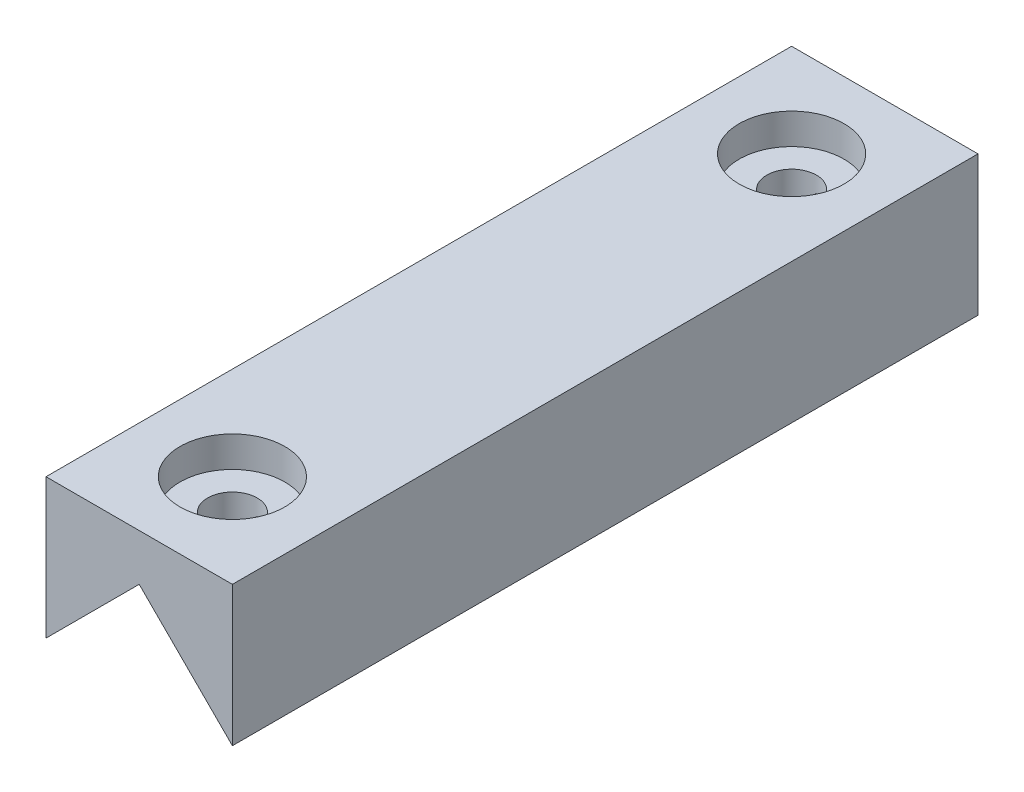
ISO-10303-21;
HEADER;
FILE_DESCRIPTION(('STEP AP214'),'2;1');
FILE_NAME('part.step','',(''),(''),'','','');
FILE_SCHEMA(('AUTOMOTIVE_DESIGN { 1 0 10303 214 1 1 1 1 }'));
ENDSEC;
DATA;
#1=APPLICATION_CONTEXT('core data for automotive mechanical design processes');
#2=APPLICATION_PROTOCOL_DEFINITION('international standard','automotive_design',2000,#1);
#3=PRODUCT_CONTEXT('',#1,'mechanical');
#4=PRODUCT('Part','Part','',(#3));
#5=PRODUCT_RELATED_PRODUCT_CATEGORY('part','',(#4));
#6=PRODUCT_DEFINITION_FORMATION('','',#4);
#7=PRODUCT_DEFINITION_CONTEXT('part definition',#1,'design');
#8=PRODUCT_DEFINITION('design','',#6,#7);
#9=PRODUCT_DEFINITION_SHAPE('','',#8);
#10=(LENGTH_UNIT() NAMED_UNIT(*) SI_UNIT(.MILLI.,.METRE.));
#11=(NAMED_UNIT(*) PLANE_ANGLE_UNIT() SI_UNIT($,.RADIAN.));
#12=(NAMED_UNIT(*) SI_UNIT($,.STERADIAN.) SOLID_ANGLE_UNIT());
#13=UNCERTAINTY_MEASURE_WITH_UNIT(LENGTH_MEASURE(1.E-05),#10,'distance_accuracy_value','');
#14=(GEOMETRIC_REPRESENTATION_CONTEXT(3) GLOBAL_UNCERTAINTY_ASSIGNED_CONTEXT((#13)) GLOBAL_UNIT_ASSIGNED_CONTEXT((#10,
#11,#12)) REPRESENTATION_CONTEXT('',''));
#15=CARTESIAN_POINT('',(0.,0.,0.));
#16=DIRECTION('',(0.,0.,1.));
#17=DIRECTION('',(1.,0.,0.));
#18=AXIS2_PLACEMENT_3D('',#15,#16,#17);
#19=CARTESIAN_POINT('',(0.,0.,101.6));
#20=DIRECTION('',(1.,0.,0.));
#21=DIRECTION('',(0.,1.,0.));
#22=AXIS2_PLACEMENT_3D('',#19,#20,#21);
#23=PLANE('',#22);
#24=DIRECTION('',(0.,-1.,0.));
#25=VECTOR('',#24,1.);
#26=CARTESIAN_POINT('',(0.,0.,0.));
#27=LINE('',#26,#25);
#28=CARTESIAN_POINT('',(0.,0.,0.));
#29=VERTEX_POINT('',#28);
#30=CARTESIAN_POINT('',(0.,-19.05,0.));
#31=VERTEX_POINT('',#30);
#32=EDGE_CURVE('E153',#29,#31,#27,.T.);
#33=ORIENTED_EDGE('',*,*,#32,.T.);
#34=DIRECTION('',(0.,0.,-1.));
#35=VECTOR('',#34,1.);
#36=CARTESIAN_POINT('',(0.,-19.05,101.6));
#37=LINE('',#36,#35);
#38=CARTESIAN_POINT('',(0.,-19.05,101.6));
#39=VERTEX_POINT('',#38);
#40=EDGE_CURVE('E113',#39,#31,#37,.T.);
#41=ORIENTED_EDGE('',*,*,#40,.F.);
#42=DIRECTION('',(0.,-1.,0.));
#43=VECTOR('',#42,1.);
#44=CARTESIAN_POINT('',(0.,0.,101.6));
#45=LINE('',#44,#43);
#46=CARTESIAN_POINT('',(0.,0.,101.6));
#47=VERTEX_POINT('',#46);
#48=EDGE_CURVE('E143',#47,#39,#45,.T.);
#49=ORIENTED_EDGE('',*,*,#48,.F.);
#50=DIRECTION('',(0.,0.,-1.));
#51=VECTOR('',#50,1.);
#52=CARTESIAN_POINT('',(0.,0.,101.6));
#53=LINE('',#52,#51);
#54=EDGE_CURVE('E133',#47,#29,#53,.T.);
#55=ORIENTED_EDGE('',*,*,#54,.T.);
#56=EDGE_LOOP('',(#33,#41,#49,#55));
#57=FACE_BOUND('',#56,.T.);
#58=ADVANCED_FACE('F39',(#57),#23,.F.);
#59=CARTESIAN_POINT('',(0.,-19.05,101.6));
#60=DIRECTION('',(-0.707106781186551,0.707106781186543,0.));
#61=DIRECTION('',(-0.707106781186544,-0.707106781186551,0.));
#62=AXIS2_PLACEMENT_3D('',#59,#60,#61);
#63=PLANE('',#62);
#64=DIRECTION('',(0.,0.,-1.));
#65=VECTOR('',#64,1.);
#66=CARTESIAN_POINT('',(12.7,-6.34999999999986,101.6));
#67=LINE('',#66,#65);
#68=CARTESIAN_POINT('',(12.7,-6.34999999999986,85.5218));
#69=VERTEX_POINT('',#68);
#70=CARTESIAN_POINT('',(12.7,-6.34999999999986,16.0782));
#71=VERTEX_POINT('',#70);
#72=EDGE_CURVE('E104',#69,#71,#67,.T.);
#73=ORIENTED_EDGE('',*,*,#72,.F.);
#74=CARTESIAN_POINT('',(12.7,-6.34999999999986,88.9));
#75=DIRECTION('',(-0.707106781186551,0.707106781186543,0.));
#76=DIRECTION('',(0.707106781186544,0.707106781186551,0.));
#77=AXIS2_PLACEMENT_3D('',#74,#75,#76);
#78=ELLIPSE('',#77,4.77749625640881,3.3782);
#79=CARTESIAN_POINT('',(12.7,-6.34999999999986,92.2782));
#80=VERTEX_POINT('',#79);
#81=EDGE_CURVE('E53',#69,#80,#78,.T.);
#82=ORIENTED_EDGE('',*,*,#81,.T.);
#83=CARTESIAN_POINT('',(12.7,-6.34999999999986,101.6));
#84=VERTEX_POINT('',#83);
#85=EDGE_CURVE('E102',#84,#80,#67,.T.);
#86=ORIENTED_EDGE('',*,*,#85,.F.);
#87=DIRECTION('',(0.707106781186544,0.707106781186552,0.));
#88=VECTOR('',#87,1.);
#89=CARTESIAN_POINT('',(0.,-19.05,101.6));
#90=LINE('',#89,#88);
#91=EDGE_CURVE('E164',#39,#84,#90,.T.);
#92=ORIENTED_EDGE('',*,*,#91,.F.);
#93=ORIENTED_EDGE('',*,*,#40,.T.);
#94=DIRECTION('',(0.707106781186544,0.707106781186552,0.));
#95=VECTOR('',#94,1.);
#96=CARTESIAN_POINT('',(0.,-19.05,0.));
#97=LINE('',#96,#95);
#98=CARTESIAN_POINT('',(12.7,-6.34999999999986,0.));
#99=VERTEX_POINT('',#98);
#100=EDGE_CURVE('E150',#31,#99,#97,.T.);
#101=ORIENTED_EDGE('',*,*,#100,.T.);
#102=CARTESIAN_POINT('',(12.7,-6.34999999999986,9.3218));
#103=VERTEX_POINT('',#102);
#104=EDGE_CURVE('E115',#103,#99,#67,.T.);
#105=ORIENTED_EDGE('',*,*,#104,.F.);
#106=CARTESIAN_POINT('',(12.7,-6.34999999999986,12.7));
#107=DIRECTION('',(-0.707106781186551,0.707106781186543,0.));
#108=DIRECTION('',(0.707106781186544,0.707106781186551,0.));
#109=AXIS2_PLACEMENT_3D('',#106,#107,#108);
#110=ELLIPSE('',#109,4.77749625640881,3.3782);
#111=EDGE_CURVE('E59',#103,#71,#110,.T.);
#112=ORIENTED_EDGE('',*,*,#111,.T.);
#113=EDGE_LOOP('',(#73,#82,#86,#92,#93,#101,#105,#112));
#114=FACE_BOUND('',#113,.T.);
#115=ADVANCED_FACE('F101',(#114),#63,.F.);
#116=CARTESIAN_POINT('',(12.7,-6.34999999999986,101.6));
#117=DIRECTION('',(0.707106781186552,0.707106781186543,0.));
#118=DIRECTION('',(-0.707106781186543,0.707106781186552,0.));
#119=AXIS2_PLACEMENT_3D('',#116,#117,#118);
#120=PLANE('',#119);
#121=ORIENTED_EDGE('',*,*,#85,.T.);
#122=CARTESIAN_POINT('',(12.7,-6.34999999999985,88.9));
#123=DIRECTION('',(0.707106781186552,0.707106781186543,0.));
#124=DIRECTION('',(-0.707106781186543,0.707106781186552,0.));
#125=AXIS2_PLACEMENT_3D('',#122,#123,#124);
#126=ELLIPSE('',#125,4.77749625640881,3.3782);
#127=EDGE_CURVE('E11',#80,#69,#126,.T.);
#128=ORIENTED_EDGE('',*,*,#127,.T.);
#129=ORIENTED_EDGE('',*,*,#72,.T.);
#130=CARTESIAN_POINT('',(12.7,-6.34999999999985,12.7));
#131=DIRECTION('',(0.707106781186552,0.707106781186543,0.));
#132=DIRECTION('',(-0.707106781186543,0.707106781186552,0.));
#133=AXIS2_PLACEMENT_3D('',#130,#131,#132);
#134=ELLIPSE('',#133,4.77749625640881,3.3782);
#135=EDGE_CURVE('E47',#71,#103,#134,.T.);
#136=ORIENTED_EDGE('',*,*,#135,.T.);
#137=ORIENTED_EDGE('',*,*,#104,.T.);
#138=DIRECTION('',(0.707106781186544,-0.707106781186552,0.));
#139=VECTOR('',#138,1.);
#140=CARTESIAN_POINT('',(12.7,-6.34999999999986,0.));
#141=LINE('',#140,#139);
#142=CARTESIAN_POINT('',(25.4,-19.05,0.));
#143=VERTEX_POINT('',#142);
#144=EDGE_CURVE('E147',#99,#143,#141,.T.);
#145=ORIENTED_EDGE('',*,*,#144,.T.);
#146=DIRECTION('',(0.,0.,-1.));
#147=VECTOR('',#146,1.);
#148=CARTESIAN_POINT('',(25.4,-19.05,101.6));
#149=LINE('',#148,#147);
#150=CARTESIAN_POINT('',(25.4,-19.05,101.6));
#151=VERTEX_POINT('',#150);
#152=EDGE_CURVE('E122',#151,#143,#149,.T.);
#153=ORIENTED_EDGE('',*,*,#152,.F.);
#154=DIRECTION('',(0.707106781186544,-0.707106781186552,0.));
#155=VECTOR('',#154,1.);
#156=CARTESIAN_POINT('',(12.7,-6.34999999999986,101.6));
#157=LINE('',#156,#155);
#158=EDGE_CURVE('E111',#84,#151,#157,.T.);
#159=ORIENTED_EDGE('',*,*,#158,.F.);
#160=EDGE_LOOP('',(#121,#128,#129,#136,#137,#145,#153,#159));
#161=FACE_BOUND('',#160,.T.);
#162=ADVANCED_FACE('F109',(#161),#120,.F.);
#163=CARTESIAN_POINT('',(25.4,0.,101.6));
#164=DIRECTION('',(-1.,0.,0.));
#165=DIRECTION('',(0.,-1.,0.));
#166=AXIS2_PLACEMENT_3D('',#163,#164,#165);
#167=PLANE('',#166);
#168=DIRECTION('',(0.,1.,0.));
#169=VECTOR('',#168,1.);
#170=CARTESIAN_POINT('',(25.4,0.,0.));
#171=LINE('',#170,#169);
#172=CARTESIAN_POINT('',(25.4,0.,0.));
#173=VERTEX_POINT('',#172);
#174=EDGE_CURVE('E144',#143,#173,#171,.T.);
#175=ORIENTED_EDGE('',*,*,#174,.T.);
#176=DIRECTION('',(0.,0.,-1.));
#177=VECTOR('',#176,1.);
#178=CARTESIAN_POINT('',(25.4,0.,101.6));
#179=LINE('',#178,#177);
#180=CARTESIAN_POINT('',(25.4,0.,101.6));
#181=VERTEX_POINT('',#180);
#182=EDGE_CURVE('E127',#181,#173,#179,.T.);
#183=ORIENTED_EDGE('',*,*,#182,.F.);
#184=DIRECTION('',(0.,1.,0.));
#185=VECTOR('',#184,1.);
#186=CARTESIAN_POINT('',(25.4,0.,101.6));
#187=LINE('',#186,#185);
#188=EDGE_CURVE('E159',#151,#181,#187,.T.);
#189=ORIENTED_EDGE('',*,*,#188,.F.);
#190=ORIENTED_EDGE('',*,*,#152,.T.);
#191=EDGE_LOOP('',(#175,#183,#189,#190));
#192=FACE_BOUND('',#191,.T.);
#193=ADVANCED_FACE('F201',(#192),#167,.F.);
#194=CARTESIAN_POINT('',(0.,0.,101.6));
#195=DIRECTION('',(0.,-1.,0.));
#196=DIRECTION('',(0.,0.,-1.));
#197=AXIS2_PLACEMENT_3D('',#194,#195,#196);
#198=PLANE('',#197);
#199=CARTESIAN_POINT('',(12.7,0.,88.9));
#200=DIRECTION('',(0.,1.,0.));
#201=DIRECTION('',(0.,0.,1.));
#202=AXIS2_PLACEMENT_3D('',#199,#200,#201);
#203=CIRCLE('',#202,7.14374999999999);
#204=CARTESIAN_POINT('',(12.7,0.,96.04375));
#205=VERTEX_POINT('',#204);
#206=EDGE_CURVE('E190',#205,#205,#203,.T.);
#207=ORIENTED_EDGE('',*,*,#206,.F.);
#208=EDGE_LOOP('',(#207));
#209=FACE_BOUND('',#208,.T.);
#210=CARTESIAN_POINT('',(12.7,0.,12.7));
#211=DIRECTION('',(0.,1.,0.));
#212=DIRECTION('',(0.,0.,1.));
#213=AXIS2_PLACEMENT_3D('',#210,#211,#212);
#214=CIRCLE('',#213,7.14374999999999);
#215=CARTESIAN_POINT('',(12.7,0.,19.84375));
#216=VERTEX_POINT('',#215);
#217=EDGE_CURVE('E106',#216,#216,#214,.T.);
#218=ORIENTED_EDGE('',*,*,#217,.F.);
#219=EDGE_LOOP('',(#218));
#220=FACE_BOUND('',#219,.T.);
#221=DIRECTION('',(-1.,0.,0.));
#222=VECTOR('',#221,1.);
#223=CARTESIAN_POINT('',(0.,0.,0.));
#224=LINE('',#223,#222);
#225=EDGE_CURVE('E140',#173,#29,#224,.T.);
#226=ORIENTED_EDGE('',*,*,#225,.T.);
#227=ORIENTED_EDGE('',*,*,#54,.F.);
#228=DIRECTION('',(-1.,0.,0.));
#229=VECTOR('',#228,1.);
#230=CARTESIAN_POINT('',(0.,0.,101.6));
#231=LINE('',#230,#229);
#232=EDGE_CURVE('E139',#181,#47,#231,.T.);
#233=ORIENTED_EDGE('',*,*,#232,.F.);
#234=ORIENTED_EDGE('',*,*,#182,.T.);
#235=EDGE_LOOP('',(#226,#227,#233,#234));
#236=FACE_BOUND('',#235,.T.);
#237=ADVANCED_FACE('F197',(#209,#220,#236),#198,.F.);
#238=CARTESIAN_POINT('',(0.,0.,101.6));
#239=DIRECTION('',(0.,0.,1.));
#240=DIRECTION('',(1.,0.,0.));
#241=AXIS2_PLACEMENT_3D('',#238,#239,#240);
#242=PLANE('',#241);
#243=ORIENTED_EDGE('',*,*,#48,.T.);
#244=ORIENTED_EDGE('',*,*,#91,.T.);
#245=ORIENTED_EDGE('',*,*,#158,.T.);
#246=ORIENTED_EDGE('',*,*,#188,.T.);
#247=ORIENTED_EDGE('',*,*,#232,.T.);
#248=EDGE_LOOP('',(#243,#244,#245,#246,#247));
#249=FACE_BOUND('',#248,.T.);
#250=ADVANCED_FACE('F200',(#249),#242,.T.);
#251=CARTESIAN_POINT('',(0.,0.,0.));
#252=DIRECTION('',(0.,0.,1.));
#253=DIRECTION('',(1.,0.,0.));
#254=AXIS2_PLACEMENT_3D('',#251,#252,#253);
#255=PLANE('',#254);
#256=ORIENTED_EDGE('',*,*,#32,.F.);
#257=ORIENTED_EDGE('',*,*,#225,.F.);
#258=ORIENTED_EDGE('',*,*,#174,.F.);
#259=ORIENTED_EDGE('',*,*,#144,.F.);
#260=ORIENTED_EDGE('',*,*,#100,.F.);
#261=EDGE_LOOP('',(#256,#257,#258,#259,#260));
#262=FACE_BOUND('',#261,.T.);
#263=ADVANCED_FACE('F214',(#262),#255,.F.);
#264=CARTESIAN_POINT('',(12.7,0.,12.7));
#265=DIRECTION('',(0.,1.,0.));
#266=DIRECTION('',(0.,0.,1.));
#267=AXIS2_PLACEMENT_3D('',#264,#265,#266);
#268=CYLINDRICAL_SURFACE('',#267,3.3782);
#269=CARTESIAN_POINT('',(12.7,-4.191,12.7));
#270=DIRECTION('',(0.,1.,0.));
#271=DIRECTION('',(0.,0.,1.));
#272=AXIS2_PLACEMENT_3D('',#269,#270,#271);
#273=CIRCLE('',#272,3.3782);
#274=CARTESIAN_POINT('',(12.7,-4.191,16.0782));
#275=VERTEX_POINT('',#274);
#276=EDGE_CURVE('E172',#275,#275,#273,.T.);
#277=ORIENTED_EDGE('',*,*,#276,.T.);
#278=EDGE_LOOP('',(#277));
#279=FACE_BOUND('',#278,.T.);
#280=ORIENTED_EDGE('',*,*,#135,.F.);
#281=ORIENTED_EDGE('',*,*,#111,.F.);
#282=EDGE_LOOP('',(#280,#281));
#283=FACE_BOUND('',#282,.T.);
#284=ADVANCED_FACE('F248',(#279,#283),#268,.F.);
#285=CARTESIAN_POINT('',(16.0782,-4.191,12.7));
#286=DIRECTION('',(0.,-1.,0.));
#287=DIRECTION('',(0.,0.,-1.));
#288=AXIS2_PLACEMENT_3D('',#285,#286,#287);
#289=PLANE('',#288);
#290=ORIENTED_EDGE('',*,*,#276,.F.);
#291=EDGE_LOOP('',(#290));
#292=FACE_BOUND('',#291,.T.);
#293=CARTESIAN_POINT('',(12.7,-4.191,12.7));
#294=DIRECTION('',(0.,1.,0.));
#295=DIRECTION('',(0.,0.,1.));
#296=AXIS2_PLACEMENT_3D('',#293,#294,#295);
#297=CIRCLE('',#296,7.14375);
#298=CARTESIAN_POINT('',(12.7,-4.191,19.84375));
#299=VERTEX_POINT('',#298);
#300=EDGE_CURVE('E176',#299,#299,#297,.T.);
#301=ORIENTED_EDGE('',*,*,#300,.T.);
#302=EDGE_LOOP('',(#301));
#303=FACE_BOUND('',#302,.T.);
#304=ADVANCED_FACE('F253',(#292,#303),#289,.F.);
#305=CARTESIAN_POINT('',(12.7,0.,12.7));
#306=DIRECTION('',(0.,1.,0.));
#307=DIRECTION('',(0.,0.,1.));
#308=AXIS2_PLACEMENT_3D('',#305,#306,#307);
#309=CYLINDRICAL_SURFACE('',#308,7.14375);
#310=ORIENTED_EDGE('',*,*,#300,.F.);
#311=EDGE_LOOP('',(#310));
#312=FACE_BOUND('',#311,.T.);
#313=ORIENTED_EDGE('',*,*,#217,.T.);
#314=EDGE_LOOP('',(#313));
#315=FACE_BOUND('',#314,.T.);
#316=ADVANCED_FACE('F265',(#312,#315),#309,.F.);
#317=CARTESIAN_POINT('',(12.7,0.,88.9));
#318=DIRECTION('',(0.,1.,0.));
#319=DIRECTION('',(0.,0.,1.));
#320=AXIS2_PLACEMENT_3D('',#317,#318,#319);
#321=CYLINDRICAL_SURFACE('',#320,3.3782);
#322=CARTESIAN_POINT('',(12.7,-4.191,88.9));
#323=DIRECTION('',(0.,1.,0.));
#324=DIRECTION('',(0.,0.,1.));
#325=AXIS2_PLACEMENT_3D('',#322,#323,#324);
#326=CIRCLE('',#325,3.3782);
#327=CARTESIAN_POINT('',(12.7,-4.191,92.2782));
#328=VERTEX_POINT('',#327);
#329=EDGE_CURVE('E107',#328,#328,#326,.T.);
#330=ORIENTED_EDGE('',*,*,#329,.T.);
#331=EDGE_LOOP('',(#330));
#332=FACE_BOUND('',#331,.T.);
#333=ORIENTED_EDGE('',*,*,#127,.F.);
#334=ORIENTED_EDGE('',*,*,#81,.F.);
#335=EDGE_LOOP('',(#333,#334));
#336=FACE_BOUND('',#335,.T.);
#337=ADVANCED_FACE('F95',(#332,#336),#321,.F.);
#338=CARTESIAN_POINT('',(16.0782,-4.191,88.9));
#339=DIRECTION('',(0.,-1.,0.));
#340=DIRECTION('',(0.,0.,-1.));
#341=AXIS2_PLACEMENT_3D('',#338,#339,#340);
#342=PLANE('',#341);
#343=ORIENTED_EDGE('',*,*,#329,.F.);
#344=EDGE_LOOP('',(#343));
#345=FACE_BOUND('',#344,.T.);
#346=CARTESIAN_POINT('',(12.7,-4.191,88.9));
#347=DIRECTION('',(0.,1.,0.));
#348=DIRECTION('',(0.,0.,1.));
#349=AXIS2_PLACEMENT_3D('',#346,#347,#348);
#350=CIRCLE('',#349,7.14375);
#351=CARTESIAN_POINT('',(12.7,-4.191,96.04375));
#352=VERTEX_POINT('',#351);
#353=EDGE_CURVE('E186',#352,#352,#350,.T.);
#354=ORIENTED_EDGE('',*,*,#353,.T.);
#355=EDGE_LOOP('',(#354));
#356=FACE_BOUND('',#355,.T.);
#357=ADVANCED_FACE('F284',(#345,#356),#342,.F.);
#358=CARTESIAN_POINT('',(12.7,0.,88.9));
#359=DIRECTION('',(0.,1.,0.));
#360=DIRECTION('',(0.,0.,1.));
#361=AXIS2_PLACEMENT_3D('',#358,#359,#360);
#362=CYLINDRICAL_SURFACE('',#361,7.14375);
#363=ORIENTED_EDGE('',*,*,#353,.F.);
#364=EDGE_LOOP('',(#363));
#365=FACE_BOUND('',#364,.T.);
#366=ORIENTED_EDGE('',*,*,#206,.T.);
#367=EDGE_LOOP('',(#366));
#368=FACE_BOUND('',#367,.T.);
#369=ADVANCED_FACE('F195',(#365,#368),#362,.F.);
#370=CLOSED_SHELL('',(#58,#115,#162,#193,#237,#250,#263,#284,#304,#316,#337,#357,#369));
#371=MANIFOLD_SOLID_BREP('B2',#370);
#372=ADVANCED_BREP_SHAPE_REPRESENTATION('',(#18,#371),#14);
#373=SHAPE_DEFINITION_REPRESENTATION(#9,#372);
ENDSEC;
END-ISO-10303-21;
